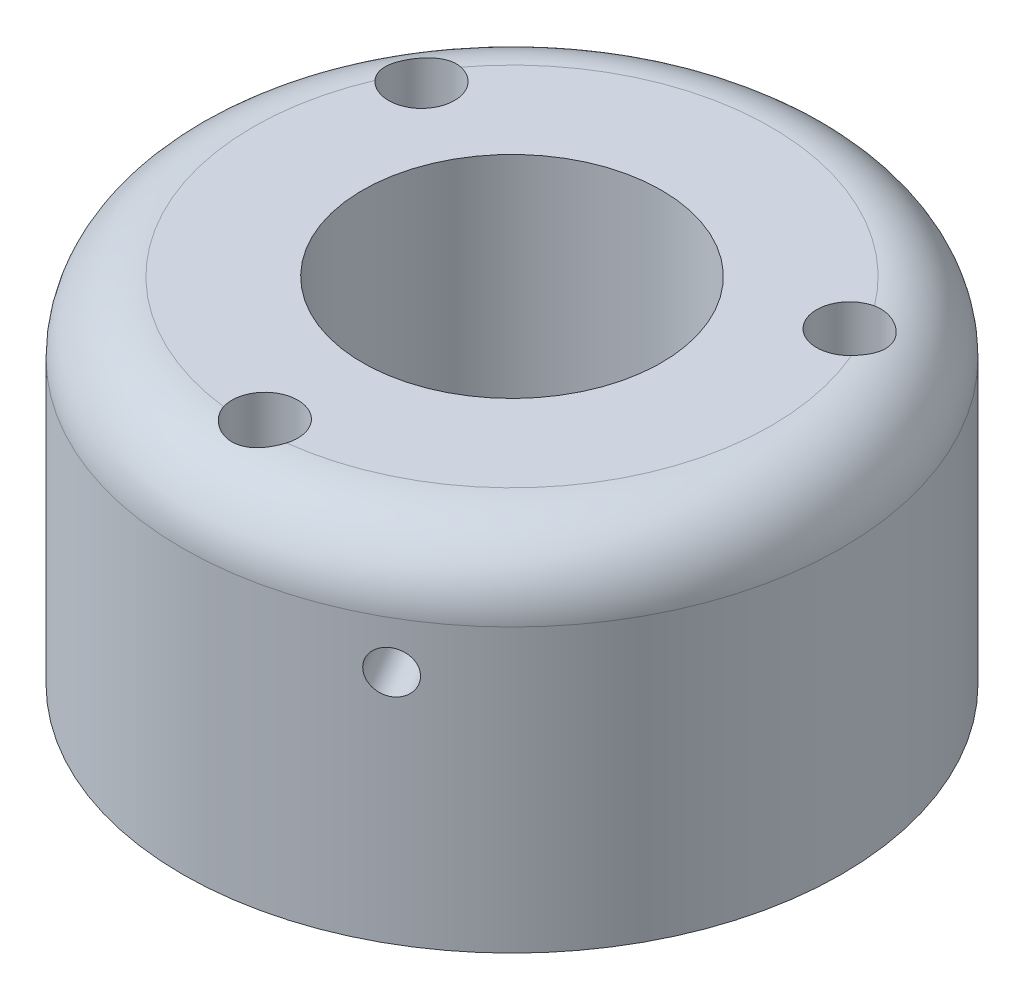
ISO-10303-21;
HEADER;
FILE_DESCRIPTION(('STEP AP214'),'2;1');
FILE_NAME('part.step','',(''),(''),'','','');
FILE_SCHEMA(('AUTOMOTIVE_DESIGN { 1 0 10303 214 1 1 1 1 }'));
ENDSEC;
DATA;
#1=APPLICATION_CONTEXT('core data for automotive mechanical design processes');
#2=APPLICATION_PROTOCOL_DEFINITION('international standard','automotive_design',2000,#1);
#3=PRODUCT_CONTEXT('',#1,'mechanical');
#4=PRODUCT('Part','Part','',(#3));
#5=PRODUCT_RELATED_PRODUCT_CATEGORY('part','',(#4));
#6=PRODUCT_DEFINITION_FORMATION('','',#4);
#7=PRODUCT_DEFINITION_CONTEXT('part definition',#1,'design');
#8=PRODUCT_DEFINITION('design','',#6,#7);
#9=PRODUCT_DEFINITION_SHAPE('','',#8);
#10=(LENGTH_UNIT() NAMED_UNIT(*) SI_UNIT(.MILLI.,.METRE.));
#11=(NAMED_UNIT(*) PLANE_ANGLE_UNIT() SI_UNIT($,.RADIAN.));
#12=(NAMED_UNIT(*) SI_UNIT($,.STERADIAN.) SOLID_ANGLE_UNIT());
#13=UNCERTAINTY_MEASURE_WITH_UNIT(LENGTH_MEASURE(1.E-05),#10,'distance_accuracy_value','');
#14=(GEOMETRIC_REPRESENTATION_CONTEXT(3) GLOBAL_UNCERTAINTY_ASSIGNED_CONTEXT((#13)) GLOBAL_UNIT_ASSIGNED_CONTEXT((#10,
#11,#12)) REPRESENTATION_CONTEXT('',''));
#15=CARTESIAN_POINT('',(0.,0.,0.));
#16=DIRECTION('',(0.,0.,1.));
#17=DIRECTION('',(1.,0.,0.));
#18=AXIS2_PLACEMENT_3D('',#15,#16,#17);
#19=CARTESIAN_POINT('',(0.,15.,0.));
#20=DIRECTION('',(0.,-1.,0.));
#21=DIRECTION('',(0.,0.,-1.));
#22=AXIS2_PLACEMENT_3D('',#19,#20,#21);
#23=CYLINDRICAL_SURFACE('',#22,14.);
#24=CARTESIAN_POINT('',(0.,12.,0.));
#25=DIRECTION('',(0.,1.,0.));
#26=DIRECTION('',(0.,0.,1.));
#27=AXIS2_PLACEMENT_3D('',#24,#25,#26);
#28=CIRCLE('',#27,14.);
#29=CARTESIAN_POINT('',(0.,12.,14.));
#30=VERTEX_POINT('',#29);
#31=EDGE_CURVE('E11',#30,#30,#28,.F.);
#32=ORIENTED_EDGE('',*,*,#31,.T.);
#33=EDGE_LOOP('',(#32));
#34=FACE_BOUND('',#33,.T.);
#35=CARTESIAN_POINT('',(0.,0.,0.));
#36=DIRECTION('',(0.,1.,0.));
#37=DIRECTION('',(0.,0.,1.));
#38=AXIS2_PLACEMENT_3D('',#35,#36,#37);
#39=CIRCLE('',#38,14.);
#40=CARTESIAN_POINT('',(0.,0.,14.));
#41=VERTEX_POINT('',#40);
#42=EDGE_CURVE('E131',#41,#41,#39,.T.);
#43=ORIENTED_EDGE('',*,*,#42,.T.);
#44=EDGE_LOOP('',(#43));
#45=FACE_BOUND('',#44,.T.);
#46=CARTESIAN_POINT('',(6.20609787595201,10.,12.549276837894));
#47=CARTESIAN_POINT('',(6.20609999284573,9.94950267598448,12.549276062729));
#48=CARTESIAN_POINT('',(6.20992918556156,9.89897006662162,12.5473843622663));
#49=CARTESIAN_POINT('',(6.22513813055935,9.79930039050013,12.5398454740784));
#50=CARTESIAN_POINT('',(6.23652665400367,9.75016501411147,12.5341939237467));
#51=CARTESIAN_POINT('',(6.26649167631466,9.65474794602,12.5192396260361));
#52=CARTESIAN_POINT('',(6.2850643600474,9.6084647547684,12.5099388165515));
#53=CARTESIAN_POINT('',(6.32881240844834,9.52004777042807,12.4878633442557));
#54=CARTESIAN_POINT('',(6.35398626871464,9.47791303491571,12.4750894729277));
#55=CARTESIAN_POINT('',(6.41020147818329,9.39891031908427,12.4462971489199));
#56=CARTESIAN_POINT('',(6.44125097170612,9.36204977546501,12.4302741903893));
#57=CARTESIAN_POINT('',(6.50824913052464,9.29470544425734,12.3953264489599));
#58=CARTESIAN_POINT('',(6.54419800077302,9.26422192357041,12.3764015446615));
#59=CARTESIAN_POINT('',(6.61994481385746,9.21047403115826,12.3360516713299));
#60=CARTESIAN_POINT('',(6.65974600336159,9.18721581951803,12.3146245903095));
#61=CARTESIAN_POINT('',(6.74198661499837,9.14861820179238,12.2697924828396));
#62=CARTESIAN_POINT('',(6.7844260075524,9.13327870694298,12.2463874785649));
#63=CARTESIAN_POINT('',(6.87063559196996,9.1109746083901,12.1982293669008));
#64=CARTESIAN_POINT('',(6.9144038441672,9.1039983480394,12.17347818626));
#65=CARTESIAN_POINT('',(7.00206287615598,9.09858274886685,12.1232696212586));
#66=CARTESIAN_POINT('',(7.0459536544933,9.10014330915092,12.0978122452479));
#67=CARTESIAN_POINT('',(7.13254802024577,9.11174744279204,12.0469613147288));
#68=CARTESIAN_POINT('',(7.17525326615978,9.12177847717929,12.0215677215004));
#69=CARTESIAN_POINT('',(7.25836085843451,9.15001935377288,11.9715726169929));
#70=CARTESIAN_POINT('',(7.29876319054988,9.16822924656576,11.9469711106139));
#71=CARTESIAN_POINT('',(7.37619872443083,9.21232510957342,11.8993177578575));
#72=CARTESIAN_POINT('',(7.41322940773714,9.23821675720414,11.8762670731705));
#73=CARTESIAN_POINT('',(7.48290524193962,9.29693703089889,11.8324902223942));
#74=CARTESIAN_POINT('',(7.51555034052056,9.32976573970245,11.8117640840346));
#75=CARTESIAN_POINT('',(7.57565842612462,9.40149905576524,11.7733036067041));
#76=CARTESIAN_POINT('',(7.60311193148399,9.44041454733569,11.7555747479518));
#77=CARTESIAN_POINT('',(7.65205447789644,9.52317864234412,11.7237757078129));
#78=CARTESIAN_POINT('',(7.67354351642618,9.56702724786912,11.7097055279741));
#79=CARTESIAN_POINT('',(7.71000738265135,9.65841988444582,11.6857291064966));
#80=CARTESIAN_POINT('',(7.72498181456386,9.70596413981315,11.6758231178467));
#81=CARTESIAN_POINT('',(7.7480312471322,9.80339524148211,11.6605404976868));
#82=CARTESIAN_POINT('',(7.756106333682,9.85328205861165,11.6551638097888));
#83=CARTESIAN_POINT('',(7.76514268455933,9.95388662905015,11.6491454250197));
#84=CARTESIAN_POINT('',(7.76611665024858,10.0046027360681,11.648495274073));
#85=CARTESIAN_POINT('',(7.76095951375784,10.1055102307222,11.6519318851311));
#86=CARTESIAN_POINT('',(7.75482845072251,10.1557016212478,11.6560186210384));
#87=CARTESIAN_POINT('',(7.73562584176534,10.2540918250589,11.6687713204567));
#88=CARTESIAN_POINT('',(7.7225601655153,10.3022922863951,11.6774334112157));
#89=CARTESIAN_POINT('',(7.68982436368927,10.3953832786039,11.699016343338));
#90=CARTESIAN_POINT('',(7.67015417474913,10.4402737777155,11.7119372255604));
#91=CARTESIAN_POINT('',(7.62467811308381,10.5255404917088,11.7415935380714));
#92=CARTESIAN_POINT('',(7.59886357398079,10.5659102108516,11.7583343548447));
#93=CARTESIAN_POINT('',(7.54177681006786,10.6409239645581,11.7950307712438));
#94=CARTESIAN_POINT('',(7.51050452881779,10.675567939903,11.8149864041149));
#95=CARTESIAN_POINT('',(7.44326526126498,10.7381982631127,11.8574610625019));
#96=CARTESIAN_POINT('',(7.40729144486579,10.7661747546072,11.8799838111545));
#97=CARTESIAN_POINT('',(7.33163875264913,10.8146084998079,11.926820607618));
#98=CARTESIAN_POINT('',(7.29195990075937,10.8350658020701,11.9511346438603));
#99=CARTESIAN_POINT('',(7.21000304544679,10.8678633331619,12.0007561105487));
#100=CARTESIAN_POINT('',(7.16772706339606,10.8802097893702,12.0260627630218));
#101=CARTESIAN_POINT('',(7.08171814672445,10.8964555357234,12.0769103150842));
#102=CARTESIAN_POINT('',(7.03798522742803,10.9003549146884,12.1024512122076));
#103=CARTESIAN_POINT('',(6.95037767789375,10.89959494449,12.1529750515549));
#104=CARTESIAN_POINT('',(6.90650344538282,10.8949510155992,12.177958916828));
#105=CARTESIAN_POINT('',(6.81979333890901,10.8772682393795,12.2267286777644));
#106=CARTESIAN_POINT('',(6.77695746674707,10.8642293774915,12.25051457135));
#107=CARTESIAN_POINT('',(6.69357250170258,10.8301303762644,12.29627386154));
#108=CARTESIAN_POINT('',(6.65302338600252,10.8090703169779,12.3182472762305));
#109=CARTESIAN_POINT('',(6.57540897902169,10.7595288427185,12.3598518637997));
#110=CARTESIAN_POINT('',(6.53834360006056,10.7310476145932,12.3794830956308));
#111=CARTESIAN_POINT('',(6.46874376153039,10.6674151850095,12.4159938786536));
#112=CARTESIAN_POINT('',(6.43621705446922,10.6322528076187,12.4328687298567));
#113=CARTESIAN_POINT('',(6.37674935617756,10.5562717547912,12.4634742096495));
#114=CARTESIAN_POINT('',(6.34980973278072,10.5154516983087,12.4772040683657));
#115=CARTESIAN_POINT('',(6.30232624686831,10.4292649780002,12.5012557552455));
#116=CARTESIAN_POINT('',(6.28179066165311,10.3838925293872,12.5115731738214));
#117=CARTESIAN_POINT('',(6.24782400613701,10.289963794438,12.5285697229299));
#118=CARTESIAN_POINT('',(6.23438462626248,10.2414113071466,12.5352531091464));
#119=CARTESIAN_POINT('',(6.21852023803515,10.1604687840326,12.5431276116879));
#120=CARTESIAN_POINT('',(6.21386841714836,10.1286017803419,12.5454314989037));
#121=CARTESIAN_POINT('',(6.2076565623278,10.0644946493665,12.5485063584345));
#122=CARTESIAN_POINT('',(6.20609652381311,10.0322545226347,12.5492773330208));
#123=CARTESIAN_POINT('',(6.20609787595201,10.,12.549276837894));
#124=B_SPLINE_CURVE_WITH_KNOTS('',3,(#46,#47,#48,#49,#50,#51,#52,#53,#54,#55,#56,#57,#58,#59,
#60,#61,#62,#63,#64,#65,#66,#67,#68,#69,#70,#71,#72,#73,#74,#75,#76,#77,#78,#79,#80,#81,#82,#83,
#84,#85,#86,#87,#88,#89,#90,#91,#92,#93,#94,#95,#96,#97,#98,#99,#100,#101,#102,#103,#104,#105,
#106,#107,#108,#109,#110,#111,#112,#113,#114,#115,#116,#117,#118,#119,#120,#121,#122,#123),
.UNSPECIFIED.,.T.,.F.,(4,2,2,2,2,2,2,2,2,2,2,2,2,2,2,2,2,2,2,2,2,2,2,2,2,2,2,2,2,2,2,2,2,2,2,2,
2,2,4),(0.,0.151374221609512,0.30292439189959,0.45439419202117,0.605829502274196,0.757476278003,
0.909129399428626,1.06091146321744,1.21269182558529,1.36426039013322,1.51582716334229,
1.66716996251336,1.81851369775786,1.96996956765537,2.12142724409545,2.27315891871627,
2.42489065752919,2.57663161323748,2.7283706798065,2.87983827280076,3.03130503129847,
3.18264378761464,3.33398399592673,3.48553894229582,3.63709545603356,3.7888746411626,
3.94065284614524,4.09231438161418,4.24397432237132,4.39536079253531,4.54674752524614,
4.69813274713631,4.8495141578692,5.00115105828367,5.15282503883811,5.30469425510545,
5.45638523767468,5.55307373724514,5.64976209355701),.UNSPECIFIED.);
#125=CARTESIAN_POINT('',(6.20609787595201,10.,12.549276837894));
#126=VERTEX_POINT('',#125);
#127=EDGE_CURVE('E129',#126,#126,#124,.T.);
#128=ORIENTED_EDGE('',*,*,#127,.F.);
#129=EDGE_LOOP('',(#128));
#130=FACE_BOUND('',#129,.T.);
#131=ADVANCED_FACE('F34',(#34,#45,#130),#23,.T.);
#132=CARTESIAN_POINT('',(0.,15.,0.));
#133=DIRECTION('',(0.,-1.,0.));
#134=DIRECTION('',(0.,0.,-1.));
#135=AXIS2_PLACEMENT_3D('',#132,#133,#134);
#136=CYLINDRICAL_SURFACE('',#135,6.35);
#137=CARTESIAN_POINT('',(0.,15.,0.));
#138=DIRECTION('',(0.,-1.,0.));
#139=DIRECTION('',(0.,0.,-1.));
#140=AXIS2_PLACEMENT_3D('',#137,#138,#139);
#141=CIRCLE('',#140,6.35);
#142=CARTESIAN_POINT('',(0.,15.,-6.35));
#143=VERTEX_POINT('',#142);
#144=EDGE_CURVE('E139',#143,#143,#141,.T.);
#145=ORIENTED_EDGE('',*,*,#144,.F.);
#146=EDGE_LOOP('',(#145));
#147=FACE_BOUND('',#146,.T.);
#148=CARTESIAN_POINT('',(0.,0.,0.));
#149=DIRECTION('',(0.,-1.,0.));
#150=DIRECTION('',(0.,0.,-1.));
#151=AXIS2_PLACEMENT_3D('',#148,#149,#150);
#152=CIRCLE('',#151,6.35);
#153=CARTESIAN_POINT('',(0.,0.,-6.35));
#154=VERTEX_POINT('',#153);
#155=EDGE_CURVE('E136',#154,#154,#152,.T.);
#156=ORIENTED_EDGE('',*,*,#155,.T.);
#157=EDGE_LOOP('',(#156));
#158=FACE_BOUND('',#157,.T.);
#159=CARTESIAN_POINT('',(2.36352559305971,10.,5.89374641216873));
#160=CARTESIAN_POINT('',(2.36352781310025,10.0502802424637,5.89374605818578));
#161=CARTESIAN_POINT('',(2.36749182693152,10.1005904585112,5.89216064592296));
#162=CARTESIAN_POINT('',(2.3832148292178,10.1998065460037,5.88581822512839));
#163=CARTESIAN_POINT('',(2.39498161081419,10.2487109623821,5.88105804571881));
#164=CARTESIAN_POINT('',(2.42587792375449,10.343664836159,5.86838080686043));
#165=CARTESIAN_POINT('',(2.44500203389271,10.3897163667502,5.86046607167387));
#166=CARTESIAN_POINT('',(2.48994402384018,10.4777153770391,5.841512710072));
#167=CARTESIAN_POINT('',(2.51576090439365,10.5196634681091,5.83047454997329));
#168=CARTESIAN_POINT('',(2.57341262748554,10.5985724271932,5.80525975287268));
#169=CARTESIAN_POINT('',(2.60528493205409,10.6354996543833,5.79106347935295));
#170=CARTESIAN_POINT('',(2.67390259714827,10.7030274507906,5.75970182139592));
#171=CARTESIAN_POINT('',(2.71064821628418,10.7336276840351,5.7425362793749));
#172=CARTESIAN_POINT('',(2.78801612631159,10.7877558809798,5.70537577726815));
#173=CARTESIAN_POINT('',(2.82865432551804,10.8112530368883,5.68536902979045));
#174=CARTESIAN_POINT('',(2.91240155812884,10.8503105139046,5.64292639986821));
#175=CARTESIAN_POINT('',(2.95551047454919,10.8658712104446,5.62049063238875));
#176=CARTESIAN_POINT('',(3.04258038199655,10.8885125489595,5.573834099492));
#177=CARTESIAN_POINT('',(3.08653371192916,10.895649407298,5.54962632554713));
#178=CARTESIAN_POINT('',(3.17426485318851,10.9014149195289,5.49991671147966));
#179=CARTESIAN_POINT('',(3.21804267316556,10.9000439980316,5.47441493600172));
#180=CARTESIAN_POINT('',(3.30385951880646,10.8888774703168,5.42305228860216));
#181=CARTESIAN_POINT('',(3.34590876063465,10.8791423363642,5.39719530214542));
#182=CARTESIAN_POINT('',(3.42747114323975,10.8516185134097,5.34577098646232));
#183=CARTESIAN_POINT('',(3.46698422450881,10.8338296355157,5.32020366404414));
#184=CARTESIAN_POINT('',(3.54260529298704,10.7906405410569,5.27015302662008));
#185=CARTESIAN_POINT('',(3.57870122969683,10.7652146181276,5.24567369841593));
#186=CARTESIAN_POINT('',(3.64647712534101,10.7074919248456,5.19878884108847));
#187=CARTESIAN_POINT('',(3.67815682418866,10.6751947501053,5.17638343413125));
#188=CARTESIAN_POINT('',(3.73663924273819,10.6043088270259,5.1343294138725));
#189=CARTESIAN_POINT('',(3.76339668521957,10.5656673123875,5.11470674123292));
#190=CARTESIAN_POINT('',(3.81109048254145,10.4833695662757,5.07926913412958));
#191=CARTESIAN_POINT('',(3.8320268084277,10.4397133098604,5.06345421860567));
#192=CARTESIAN_POINT('',(3.86762590134237,10.34857370591,5.0363154892842));
#193=CARTESIAN_POINT('',(3.88228462638836,10.3010879159472,5.02499456939414));
#194=CARTESIAN_POINT('',(3.90497826329582,10.2036648213403,5.0073798599995));
#195=CARTESIAN_POINT('',(3.91301358968135,10.1537276703213,5.00108575589345));
#196=CARTESIAN_POINT('',(3.92223801364166,10.05328245873,4.99385457937796));
#197=CARTESIAN_POINT('',(3.92348579650372,10.0027830872068,4.9928715874485));
#198=CARTESIAN_POINT('',(3.91926475641561,9.90224163398887,4.9961856138318));
#199=CARTESIAN_POINT('',(3.91379611883104,9.85219953971225,5.00048248642626));
#200=CARTESIAN_POINT('',(3.89630516274304,9.75421910689409,5.01412274734323));
#201=CARTESIAN_POINT('',(3.88431193663121,9.70627244279373,5.02344373203916));
#202=CARTESIAN_POINT('',(3.85405545126092,9.613582081972,5.04669381285137));
#203=CARTESIAN_POINT('',(3.83579191316423,9.56883852779858,5.0606231138966));
#204=CARTESIAN_POINT('',(3.7932472791012,9.48349266727188,5.09259120468687));
#205=CARTESIAN_POINT('',(3.76892641974704,9.44292033406228,5.1106570832013));
#206=CARTESIAN_POINT('',(3.71486328572855,9.3673759292022,5.15008809662905));
#207=CARTESIAN_POINT('',(3.68512073830451,9.33240413947581,5.17145339752474));
#208=CARTESIAN_POINT('',(3.62064103929824,9.26879059433453,5.21680174416725));
#209=CARTESIAN_POINT('',(3.58586855902885,9.24019759219678,5.24080298990689));
#210=CARTESIAN_POINT('',(3.51232338262757,9.19049212159547,5.29037316284831));
#211=CARTESIAN_POINT('',(3.47355078621016,9.16937946672072,5.3159420509656));
#212=CARTESIAN_POINT('',(3.3931203906478,9.13531281897608,5.36763539237509));
#213=CARTESIAN_POINT('',(3.35147272791636,9.122331640129,5.39375768928713));
#214=CARTESIAN_POINT('',(3.26629455956808,9.10480827810918,5.44576057164266));
#215=CARTESIAN_POINT('',(3.222764164572,9.10026559981601,5.47164117117883));
#216=CARTESIAN_POINT('',(3.13543906386586,9.09975928066233,5.52214124866931));
#217=CARTESIAN_POINT('',(3.09165001289754,9.10372084462056,5.54676978721703));
#218=CARTESIAN_POINT('',(3.00470419254861,9.11995090388287,5.59434619825955));
#219=CARTESIAN_POINT('',(2.96154742175292,9.13221938059277,5.61729407451622));
#220=CARTESIAN_POINT('',(2.87717691851967,9.16468951265263,5.66097255102201));
#221=CARTESIAN_POINT('',(2.83596206835269,9.18488654044152,5.68170443568798));
#222=CARTESIAN_POINT('',(2.75669502317559,9.23263259057649,5.72058422307279));
#223=CARTESIAN_POINT('',(2.71864290849197,9.26018179957696,5.73873206017085));
#224=CARTESIAN_POINT('',(2.64657195992202,9.32212294274866,5.77232651711363));
#225=CARTESIAN_POINT('',(2.61258959145261,9.35657027659383,5.78774922998046));
#226=CARTESIAN_POINT('',(2.55011631531478,9.43121348024346,5.81554632438171));
#227=CARTESIAN_POINT('',(2.52162670148719,9.47141070058246,5.8279199878905));
#228=CARTESIAN_POINT('',(2.47096998019096,9.55664665009723,5.84957882037539));
#229=CARTESIAN_POINT('',(2.44883509637157,9.60170851392795,5.85884828669913));
#230=CARTESIAN_POINT('',(2.4118724891311,9.69521102002221,5.87416163323606));
#231=CARTESIAN_POINT('',(2.39703705452118,9.74364803470969,5.88020891794697));
#232=CARTESIAN_POINT('',(2.37862332191816,9.82692892552903,5.88767468966328));
#233=CARTESIAN_POINT('',(2.37297173557425,9.86125433354262,5.88995092169096));
#234=CARTESIAN_POINT('',(2.36542212298868,9.93038170725221,5.89298689722956));
#235=CARTESIAN_POINT('',(2.36352405580243,9.96518366774567,5.89374665728266));
#236=CARTESIAN_POINT('',(2.36352559305971,10.,5.89374641216873));
#237=B_SPLINE_CURVE_WITH_KNOTS('',3,(#159,#160,#161,#162,#163,#164,#165,#166,#167,#168,#169,
#170,#171,#172,#173,#174,#175,#176,#177,#178,#179,#180,#181,#182,#183,#184,#185,#186,#187,#188,
#189,#190,#191,#192,#193,#194,#195,#196,#197,#198,#199,#200,#201,#202,#203,#204,#205,#206,#207,
#208,#209,#210,#211,#212,#213,#214,#215,#216,#217,#218,#219,#220,#221,#222,#223,#224,#225,#226,
#227,#228,#229,#230,#231,#232,#233,#234,#235,#236),.UNSPECIFIED.,.T.,.F.,(4,2,2,2,2,2,2,2,2,2,2,
2,2,2,2,2,2,2,2,2,2,2,2,2,2,2,2,2,2,2,2,2,2,2,2,2,2,2,4),(0.,0.150713494565003,
0.301577743864351,0.452331041954934,0.603061844961302,0.754757445237245,0.906461098707779,
1.05881358732013,1.2111588682671,1.36248162129027,1.51379682208597,1.66402715027234,
1.81426100213868,1.96500632006344,2.11576051212664,2.26783874791001,2.41991774011718,
2.57209450530924,2.72426174582612,2.87511122802495,3.02595654704242,3.17613471198119,
3.32631955614693,3.47751754958608,3.62872315174538,3.78104758632851,3.93336822470074,
4.08517685242569,4.2369765726525,4.38744668079017,4.53791645211693,4.68829853084439,
4.83868442777848,4.99033037620199,5.14201200192351,5.29444971421136,5.4467260426265,
5.55108807600073,5.65544897095419),.UNSPECIFIED.);
#238=CARTESIAN_POINT('',(2.36352559305971,10.,5.89374641216873));
#239=VERTEX_POINT('',#238);
#240=EDGE_CURVE('E123',#239,#239,#237,.T.);
#241=ORIENTED_EDGE('',*,*,#240,.F.);
#242=EDGE_LOOP('',(#241));
#243=FACE_BOUND('',#242,.T.);
#244=ADVANCED_FACE('F116',(#147,#158,#243),#136,.F.);
#245=CARTESIAN_POINT('',(0.,15.,0.));
#246=DIRECTION('',(0.,1.,0.));
#247=DIRECTION('',(0.,0.,1.));
#248=AXIS2_PLACEMENT_3D('',#245,#246,#247);
#249=PLANE('',#248);
#250=CARTESIAN_POINT('',(0.,15.,10.5));
#251=DIRECTION('',(0.,-1.,0.));
#252=DIRECTION('',(0.,0.,-1.));
#253=AXIS2_PLACEMENT_3D('',#250,#251,#252);
#254=CIRCLE('',#253,1.4);
#255=CARTESIAN_POINT('',(-1.33596330757386,15.,10.9185714285714));
#256=VERTEX_POINT('',#255);
#257=CARTESIAN_POINT('',(1.33596330757386,15.,10.9185714285714));
#258=VERTEX_POINT('',#257);
#259=EDGE_CURVE('E134',#256,#258,#254,.T.);
#260=ORIENTED_EDGE('',*,*,#259,.T.);
#261=CARTESIAN_POINT('',(0.,15.,0.));
#262=DIRECTION('',(0.,1.,0.));
#263=DIRECTION('',(0.,0.,1.));
#264=AXIS2_PLACEMENT_3D('',#261,#262,#263);
#265=CIRCLE('',#264,11.);
#266=CARTESIAN_POINT('',(10.1237418839647,15.,-4.30230755140292));
#267=VERTEX_POINT('',#266);
#268=EDGE_CURVE('E79',#258,#267,#265,.T.);
#269=ORIENTED_EDGE('',*,*,#268,.T.);
#270=CARTESIAN_POINT('',(9.09326673973658,15.,-5.25000000000004));
#271=DIRECTION('',(0.,-1.,0.));
#272=DIRECTION('',(0.,0.,-1.));
#273=AXIS2_PLACEMENT_3D('',#270,#271,#272);
#274=CIRCLE('',#273,1.4);
#275=CARTESIAN_POINT('',(8.78777857639085,15.,-6.6162638771686));
#276=VERTEX_POINT('',#275);
#277=EDGE_CURVE('E76',#267,#276,#274,.T.);
#278=ORIENTED_EDGE('',*,*,#277,.T.);
#279=CARTESIAN_POINT('',(0.,15.,0.));
#280=DIRECTION('',(0.,1.,0.));
#281=DIRECTION('',(0.,0.,1.));
#282=AXIS2_PLACEMENT_3D('',#279,#280,#281);
#283=CIRCLE('',#282,11.);
#284=CARTESIAN_POINT('',(-8.78777857639094,15.,-6.61626387716847));
#285=VERTEX_POINT('',#284);
#286=EDGE_CURVE('E69',#276,#285,#283,.T.);
#287=ORIENTED_EDGE('',*,*,#286,.T.);
#288=CARTESIAN_POINT('',(-9.09326673973666,15.,-5.24999999999992));
#289=DIRECTION('',(0.,-1.,0.));
#290=DIRECTION('',(0.,0.,-1.));
#291=AXIS2_PLACEMENT_3D('',#288,#289,#290);
#292=CIRCLE('',#291,1.4);
#293=CARTESIAN_POINT('',(-10.1237418839648,15.,-4.30230755140278));
#294=VERTEX_POINT('',#293);
#295=EDGE_CURVE('E73',#285,#294,#292,.T.);
#296=ORIENTED_EDGE('',*,*,#295,.T.);
#297=CARTESIAN_POINT('',(0.,15.,0.));
#298=DIRECTION('',(0.,1.,0.));
#299=DIRECTION('',(0.,0.,1.));
#300=AXIS2_PLACEMENT_3D('',#297,#298,#299);
#301=CIRCLE('',#300,11.);
#302=EDGE_CURVE('E50',#294,#256,#301,.T.);
#303=ORIENTED_EDGE('',*,*,#302,.T.);
#304=EDGE_LOOP('',(#260,#269,#278,#287,#296,#303));
#305=FACE_BOUND('',#304,.T.);
#306=ORIENTED_EDGE('',*,*,#144,.T.);
#307=EDGE_LOOP('',(#306));
#308=FACE_BOUND('',#307,.T.);
#309=ADVANCED_FACE('F71',(#305,#308),#249,.T.);
#310=CARTESIAN_POINT('',(0.,0.,0.));
#311=DIRECTION('',(0.,1.,0.));
#312=DIRECTION('',(0.,0.,1.));
#313=AXIS2_PLACEMENT_3D('',#310,#311,#312);
#314=PLANE('',#313);
#315=CARTESIAN_POINT('',(-9.0932667397366,0.,5.24999999999926));
#316=DIRECTION('',(0.,-1.,0.));
#317=DIRECTION('',(0.,0.,-1.));
#318=AXIS2_PLACEMENT_3D('',#315,#316,#317);
#319=CIRCLE('',#318,2.8);
#320=CARTESIAN_POINT('',(-9.0932667397366,0.,2.44999999999926));
#321=VERTEX_POINT('',#320);
#322=EDGE_CURVE('E307',#321,#321,#319,.T.);
#323=ORIENTED_EDGE('',*,*,#322,.F.);
#324=EDGE_LOOP('',(#323));
#325=FACE_BOUND('',#324,.T.);
#326=CARTESIAN_POINT('',(6.30852653991129E-13,0.,-10.5000000000004));
#327=DIRECTION('',(0.,-1.,0.));
#328=DIRECTION('',(0.,0.,-1.));
#329=AXIS2_PLACEMENT_3D('',#326,#327,#328);
#330=CIRCLE('',#329,2.8);
#331=CARTESIAN_POINT('',(6.30852653991129E-13,0.,-13.3000000000004));
#332=VERTEX_POINT('',#331);
#333=EDGE_CURVE('E306',#332,#332,#330,.T.);
#334=ORIENTED_EDGE('',*,*,#333,.F.);
#335=EDGE_LOOP('',(#334));
#336=FACE_BOUND('',#335,.T.);
#337=CARTESIAN_POINT('',(9.09326673973662,0.,5.24999999999998));
#338=DIRECTION('',(0.,-1.,0.));
#339=DIRECTION('',(0.,0.,-1.));
#340=AXIS2_PLACEMENT_3D('',#337,#338,#339);
#341=CIRCLE('',#340,2.8);
#342=CARTESIAN_POINT('',(9.09326673973662,0.,2.44999999999998));
#343=VERTEX_POINT('',#342);
#344=EDGE_CURVE('E173',#343,#343,#341,.T.);
#345=ORIENTED_EDGE('',*,*,#344,.F.);
#346=EDGE_LOOP('',(#345));
#347=FACE_BOUND('',#346,.T.);
#348=CARTESIAN_POINT('',(0.,0.,10.5));
#349=DIRECTION('',(0.,-1.,0.));
#350=DIRECTION('',(0.,0.,-1.));
#351=AXIS2_PLACEMENT_3D('',#348,#349,#350);
#352=CIRCLE('',#351,1.4);
#353=CARTESIAN_POINT('',(0.,0.,9.1));
#354=VERTEX_POINT('',#353);
#355=EDGE_CURVE('E146',#354,#354,#352,.T.);
#356=ORIENTED_EDGE('',*,*,#355,.F.);
#357=EDGE_LOOP('',(#356));
#358=FACE_BOUND('',#357,.T.);
#359=ORIENTED_EDGE('',*,*,#155,.F.);
#360=EDGE_LOOP('',(#359));
#361=FACE_BOUND('',#360,.T.);
#362=ORIENTED_EDGE('',*,*,#42,.F.);
#363=EDGE_LOOP('',(#362));
#364=FACE_BOUND('',#363,.T.);
#365=CARTESIAN_POINT('',(9.09326673973658,0.,-5.25000000000004));
#366=DIRECTION('',(0.,-1.,0.));
#367=DIRECTION('',(0.,0.,-1.));
#368=AXIS2_PLACEMENT_3D('',#365,#366,#367);
#369=CIRCLE('',#368,1.4);
#370=CARTESIAN_POINT('',(9.09326673973658,0.,-6.65000000000004));
#371=VERTEX_POINT('',#370);
#372=EDGE_CURVE('E85',#371,#371,#369,.T.);
#373=ORIENTED_EDGE('',*,*,#372,.F.);
#374=EDGE_LOOP('',(#373));
#375=FACE_BOUND('',#374,.T.);
#376=CARTESIAN_POINT('',(-9.09326673973666,0.,-5.24999999999992));
#377=DIRECTION('',(0.,-1.,0.));
#378=DIRECTION('',(0.,0.,-1.));
#379=AXIS2_PLACEMENT_3D('',#376,#377,#378);
#380=CIRCLE('',#379,1.4);
#381=CARTESIAN_POINT('',(-9.09326673973666,0.,-6.64999999999992));
#382=VERTEX_POINT('',#381);
#383=EDGE_CURVE('E86',#382,#382,#380,.T.);
#384=ORIENTED_EDGE('',*,*,#383,.F.);
#385=EDGE_LOOP('',(#384));
#386=FACE_BOUND('',#385,.T.);
#387=ADVANCED_FACE('F152',(#325,#336,#347,#358,#361,#364,#375,#386),#314,.F.);
#388=CARTESIAN_POINT('',(0.,15.,10.5));
#389=DIRECTION('',(0.,-1.,0.));
#390=DIRECTION('',(0.,0.,-1.));
#391=AXIS2_PLACEMENT_3D('',#388,#389,#390);
#392=CYLINDRICAL_SURFACE('',#391,1.4);
#393=ORIENTED_EDGE('',*,*,#259,.F.);
#394=CARTESIAN_POINT('',(-1.33596330757386,15.,10.9185714285714));
#395=CARTESIAN_POINT('',(-1.32441401062772,15.0000018380381,10.9554372260775));
#396=CARTESIAN_POINT('',(-1.31134277213357,14.9993804968653,10.9918018824445));
#397=CARTESIAN_POINT('',(-1.28226315501589,14.9970455140652,11.0632849834086));
#398=CARTESIAN_POINT('',(-1.26625594297071,14.9953323056133,11.0984039163901));
#399=CARTESIAN_POINT('',(-1.21408917627997,14.988799285299,11.2013440696474));
#400=CARTESIAN_POINT('',(-1.17370728329223,14.9825840521503,11.2669936252768));
#401=CARTESIAN_POINT('',(-1.08297623655958,14.9678507040426,11.3905284637219));
#402=CARTESIAN_POINT('',(-1.03263679934041,14.9593348310974,11.4484212239332));
#403=CARTESIAN_POINT('',(-0.923249235621274,14.9414488399935,11.555202946673));
#404=CARTESIAN_POINT('',(-0.864196498796118,14.9320782706117,11.6040871116468));
#405=CARTESIAN_POINT('',(-0.736818650376979,14.9135969092506,11.6930320798699));
#406=CARTESIAN_POINT('',(-0.668255353452161,14.904504331399,11.7327562361636));
#407=CARTESIAN_POINT('',(-0.525220228457292,14.8882980444874,11.8001504016845));
#408=CARTESIAN_POINT('',(-0.450749111496837,14.8811840977276,11.8278218590704));
#409=CARTESIAN_POINT('',(-0.298638519391847,14.870070107299,11.87003259883));
#410=CARTESIAN_POINT('',(-0.221032097817005,14.8660436102318,11.8846836173851));
#411=CARTESIAN_POINT('',(-0.0643678581779517,14.8616234458039,11.9007332035797));
#412=CARTESIAN_POINT('',(0.0146895966556971,14.8612288813777,11.902135043689));
#413=CARTESIAN_POINT('',(0.169302034956192,14.8640827575054,11.8918143741052));
#414=CARTESIAN_POINT('',(0.244887806730471,14.8672142538447,11.8805131899316));
#415=CARTESIAN_POINT('',(0.393044883455445,14.8764779630047,11.8458473663809));
#416=CARTESIAN_POINT('',(0.465615942207524,14.8826104203804,11.8224817438374));
#417=CARTESIAN_POINT('',(0.606382726589488,14.8970648837805,11.764180051341));
#418=CARTESIAN_POINT('',(0.674539364779257,14.905403801916,11.7291540470001));
#419=CARTESIAN_POINT('',(0.804174214477187,14.9230658350847,11.6485351993392));
#420=CARTESIAN_POINT('',(0.865649661498044,14.9323893543956,11.6029380062264));
#421=CARTESIAN_POINT('',(0.98235605808981,14.9509679368099,11.5006022779807));
#422=CARTESIAN_POINT('',(1.03730293333163,14.9602098475059,11.4435371113144));
#423=CARTESIAN_POINT('',(1.13687592508638,14.976680960134,11.3208172522153));
#424=CARTESIAN_POINT('',(1.18151392250238,14.9839124810045,11.2551725856678));
#425=CARTESIAN_POINT('',(1.24415351248499,14.992693759531,11.1437787473555));
#426=CARTESIAN_POINT('',(1.2657878417463,14.9953591847075,11.1001229597592));
#427=CARTESIAN_POINT('',(1.30441092088983,14.9990147570253,11.010767816507));
#428=CARTESIAN_POINT('',(1.32140233571101,15.0000058668899,10.9650696507367));
#429=CARTESIAN_POINT('',(1.33596330757386,15.,10.9185714285714));
#430=B_SPLINE_CURVE_WITH_KNOTS('',3,(#394,#395,#396,#397,#398,#399,#400,#401,#402,#403,#404,
#405,#406,#407,#408,#409,#410,#411,#412,#413,#414,#415,#416,#417,#418,#419,#420,#421,#422,#423,
#424,#425,#426,#427,#428,#429),.UNSPECIFIED.,.F.,.F.,(4,2,2,2,2,2,2,2,2,2,2,2,2,2,2,2,2,4),(0.,
0.115816211482048,0.231586503905991,0.462366827065027,0.692923056974565,0.923601717701415,
1.16174384972508,1.3998573605392,1.63590717515908,1.87189868532577,2.10028810144546,
2.32869613262382,2.55890830384832,2.78921537056067,3.02736824320629,3.26524526131888,
3.41136165398058,3.55739400177309),.UNSPECIFIED.);
#431=EDGE_CURVE('E43',#256,#258,#430,.T.);
#432=ORIENTED_EDGE('',*,*,#431,.T.);
#433=EDGE_LOOP('',(#393,#432));
#434=FACE_BOUND('',#433,.T.);
#435=ORIENTED_EDGE('',*,*,#355,.T.);
#436=EDGE_LOOP('',(#435));
#437=FACE_BOUND('',#436,.T.);
#438=ADVANCED_FACE('F114',(#434,#437),#392,.F.);
#439=CARTESIAN_POINT('',(9.09326673973658,15.,-5.25000000000004));
#440=DIRECTION('',(0.,-1.,0.));
#441=DIRECTION('',(0.,0.,-1.));
#442=AXIS2_PLACEMENT_3D('',#439,#440,#441);
#443=CYLINDRICAL_SURFACE('',#442,1.4);
#444=ORIENTED_EDGE('',*,*,#277,.F.);
#445=CARTESIAN_POINT('',(10.1237418839647,15.,-4.30230755140292));
#446=CARTESIAN_POINT('',(10.1498939526627,15.0000018380381,-4.33074243470715));
#447=CARTESIAN_POINT('',(10.1748510496293,14.9993804968653,-4.3602447874855));
#448=CARTESIAN_POINT('',(10.2222174224467,14.9970455140652,-4.42117002512383));
#449=CARTESIAN_POINT('',(10.2446277045399,14.9953323056133,-4.45259214388943));
#450=CARTESIAN_POINT('',(10.3076931089847,14.988799285299,-4.54923996570555));
#451=CARTESIAN_POINT('',(10.3443563454132,14.9825840521503,-4.61703648870058));
#452=CARTESIAN_POINT('',(10.4059751303927,14.9678507040426,-4.75737929930555));
#453=CARTESIAN_POINT('',(10.4309420128213,14.9593348310974,-4.8299209108552));
#454=CARTESIAN_POINT('',(10.4687239155142,14.9414488399935,-4.97804418126396));
#455=CARTESIAN_POINT('',(10.4815324758118,14.9320782706117,-5.05362743400445));
#456=CARTESIAN_POINT('',(10.4948721536221,14.9135969092506,-5.20841237072635));
#457=CARTESIAN_POINT('',(10.4949926336541,14.904504331399,-5.28765200577735));
#458=CARTESIAN_POINT('',(10.4818401305646,14.8882980444874,-5.44522114041683));
#459=CARTESIAN_POINT('',(10.4685687571402,14.8811840977276,-5.52355074824572));
#460=CARTESIAN_POINT('',(10.4290690340321,14.870070107299,-5.67638775507312));
#461=CARTESIAN_POINT('',(10.4029539775047,14.8660436102318,-5.7509223969313));
#462=CARTESIAN_POINT('',(10.3385212070499,14.8616234458039,-5.89462240142058));
#463=CARTESIAN_POINT('',(10.3002065087798,14.8612288813777,-5.96378908571972));
#464=CARTESIAN_POINT('',(10.2139623275859,14.8640827575054,-6.0925270502371));
#465=CARTESIAN_POINT('',(10.1663823291116,14.8672142538447,-6.1523356566715));
#466=CARTESIAN_POINT('',(10.0622823069111,14.8764779630047,-6.26331053709041));
#467=CARTESIAN_POINT('',(10.0057615548372,14.8826104203804,-6.3144761062775));
#468=CARTESIAN_POINT('',(9.88488741586064,14.8970648837805,-6.40723287131311));
#469=CARTESIAN_POINT('',(9.82047568721351,14.905403801916,-6.44874524925157));
#470=CARTESIAN_POINT('',(9.68584029226635,14.9230658350847,-6.52070289847529));
#471=CARTESIAN_POINT('',(9.61561424117894,14.9323893543956,-6.55114360074793));
#472=CARTESIAN_POINT('',(9.4686357025075,14.9509679368099,-6.60104644085769));
#473=CARTESIAN_POINT('',(9.39174238088239,14.9602098475059,-6.62009924734253));
#474=CARTESIAN_POINT('',(9.23567736947642,14.976680960134,-6.64497205818345));
#475=CARTESIAN_POINT('',(9.15650842191525,14.9839124810045,-6.65080736464599));
#476=CARTESIAN_POINT('',(9.02871873312045,14.992693759531,-6.64935792169743));
#477=CARTESIAN_POINT('',(8.98009454740924,14.9953591847075,-6.64626590663344));
#478=CARTESIAN_POINT('',(8.8833991838222,14.9990147570253,-6.63503690271798));
#479=CARTESIAN_POINT('',(8.83532770394818,15.0000058668899,-6.62690281671421));
#480=CARTESIAN_POINT('',(8.78777857639084,15.,-6.6162638771686));
#481=B_SPLINE_CURVE_WITH_KNOTS('',3,(#445,#446,#447,#448,#449,#450,#451,#452,#453,#454,#455,
#456,#457,#458,#459,#460,#461,#462,#463,#464,#465,#466,#467,#468,#469,#470,#471,#472,#473,#474,
#475,#476,#477,#478,#479,#480),.UNSPECIFIED.,.F.,.F.,(4,2,2,2,2,2,2,2,2,2,2,2,2,2,2,2,2,4),(0.,
0.115816211482051,0.231586503905993,0.462366827065028,0.692923056974569,0.923601717701416,
1.16174384972508,1.3998573605392,1.63590717515908,1.87189868532577,2.10028810144547,
2.32869613262382,2.55890830384832,2.78921537056067,3.02736824320629,3.26524526131889,
3.41136165398058,3.55739400177309),.UNSPECIFIED.);
#482=EDGE_CURVE('E88',#267,#276,#481,.T.);
#483=ORIENTED_EDGE('',*,*,#482,.T.);
#484=EDGE_LOOP('',(#444,#483));
#485=FACE_BOUND('',#484,.T.);
#486=ORIENTED_EDGE('',*,*,#372,.T.);
#487=EDGE_LOOP('',(#486));
#488=FACE_BOUND('',#487,.T.);
#489=ADVANCED_FACE('F108',(#485,#488),#443,.F.);
#490=CARTESIAN_POINT('',(-9.09326673973666,15.,-5.24999999999992));
#491=DIRECTION('',(0.,-1.,0.));
#492=DIRECTION('',(0.,0.,-1.));
#493=AXIS2_PLACEMENT_3D('',#490,#491,#492);
#494=CYLINDRICAL_SURFACE('',#493,1.4);
#495=ORIENTED_EDGE('',*,*,#295,.F.);
#496=CARTESIAN_POINT('',(-8.78777857639094,15.,-6.61626387716847));
#497=CARTESIAN_POINT('',(-8.82547994203502,15.0000018380381,-6.6246947913703));
#498=CARTESIAN_POINT('',(-8.8635082774958,14.9993804968653,-6.63155709495893));
#499=CARTESIAN_POINT('',(-8.93995426743091,14.9970455140652,-6.64211495828479));
#500=CARTESIAN_POINT('',(-8.97837176156922,14.9953323056133,-6.64581177250061));
#501=CARTESIAN_POINT('',(-9.09360393270486,14.988799285299,-6.65210410394177));
#502=CARTESIAN_POINT('',(-9.17064906212102,14.9825840521503,-6.64995713657622));
#503=CARTESIAN_POINT('',(-9.32299889383319,14.9678507040426,-6.63314916441634));
#504=CARTESIAN_POINT('',(-9.39830521348093,14.9593348310974,-6.61850031307795));
#505=CARTESIAN_POINT('',(-9.54547467989304,14.9414488399935,-6.577158765409));
#506=CARTESIAN_POINT('',(-9.61733597701573,14.9320782706117,-6.55045967764232));
#507=CARTESIAN_POINT('',(-9.75805350324525,14.9135969092506,-6.48461970914347));
#508=CARTESIAN_POINT('',(-9.82673728020199,14.904504331399,-6.44510423038625));
#509=CARTESIAN_POINT('',(-9.95661990210735,14.8882980444874,-6.35492926126765));
#510=CARTESIAN_POINT('',(-10.0178196456435,14.8811840977276,-6.30427111082463));
#511=CARTESIAN_POINT('',(-10.1304305146403,14.870070107299,-6.1936448437568));
#512=CARTESIAN_POINT('',(-10.1819218796878,14.8660436102318,-6.13376122045375));
#513=CARTESIAN_POINT('',(-10.274153348872,14.8616234458039,-6.00611080215903));
#514=CARTESIAN_POINT('',(-10.3148961054356,14.8612288813777,-5.93834595796922));
#515=CARTESIAN_POINT('',(-10.3832643625422,14.8640827575054,-5.79928732386803));
#516=CARTESIAN_POINT('',(-10.4112701358422,14.8672142538447,-5.72817753326007));
#517=CARTESIAN_POINT('',(-10.4553271903666,14.8764779630047,-5.58253682929044));
#518=CARTESIAN_POINT('',(-10.4713774970448,14.8826104203804,-5.50800563755987));
#519=CARTESIAN_POINT('',(-10.4912701424502,14.8970648837805,-5.35694718002782));
#520=CARTESIAN_POINT('',(-10.4950150519928,14.905403801916,-5.28040879774851));
#521=CARTESIAN_POINT('',(-10.4900145067436,14.9230658350847,-5.12783230086387));
#522=CARTESIAN_POINT('',(-10.4812639026771,14.9323893543956,-5.05179440547838));
#523=CARTESIAN_POINT('',(-10.4509917605974,14.9509679368099,-4.89955583712292));
#524=CARTESIAN_POINT('',(-10.4290453142141,14.9602098475059,-4.82343786397179));
#525=CARTESIAN_POINT('',(-10.3725532945629,14.976680960134,-4.67584519403184));
#526=CARTESIAN_POINT('',(-10.3380223444177,14.9839124810045,-4.60436522102173));
#527=CARTESIAN_POINT('',(-10.2728722456055,14.992693759531,-4.49442082565801));
#528=CARTESIAN_POINT('',(-10.2458823891556,14.9953591847075,-4.45385705312575));
#529=CARTESIAN_POINT('',(-10.1878101047121,14.9990147570253,-4.37573091378894));
#530=CARTESIAN_POINT('',(-10.1567300396593,15.0000058668899,-4.33816683402241));
#531=CARTESIAN_POINT('',(-10.1237418839648,15.,-4.30230755140278));
#532=B_SPLINE_CURVE_WITH_KNOTS('',3,(#496,#497,#498,#499,#500,#501,#502,#503,#504,#505,#506,
#507,#508,#509,#510,#511,#512,#513,#514,#515,#516,#517,#518,#519,#520,#521,#522,#523,#524,#525,
#526,#527,#528,#529,#530,#531),.UNSPECIFIED.,.F.,.F.,(4,2,2,2,2,2,2,2,2,2,2,2,2,2,2,2,2,4),(0.,
0.11581621148205,0.231586503905992,0.462366827065026,0.692923056974566,0.923601717701414,
1.16174384972508,1.3998573605392,1.63590717515908,1.87189868532577,2.10028810144546,
2.32869613262382,2.55890830384832,2.78921537056067,3.02736824320629,3.26524526131889,
3.41136165398058,3.55739400177309),.UNSPECIFIED.);
#533=EDGE_CURVE('E84',#285,#294,#532,.T.);
#534=ORIENTED_EDGE('',*,*,#533,.T.);
#535=EDGE_LOOP('',(#495,#534));
#536=FACE_BOUND('',#535,.T.);
#537=ORIENTED_EDGE('',*,*,#383,.T.);
#538=EDGE_LOOP('',(#537));
#539=FACE_BOUND('',#538,.T.);
#540=ADVANCED_FACE('F82',(#536,#539),#494,.F.);
#541=CARTESIAN_POINT('',(13.0466333698684,10.,22.5974318643354));
#542=DIRECTION('',(-0.500000000000004,0.,-0.866025403784436));
#543=DIRECTION('',(-0.866025403784436,0.,0.500000000000004));
#544=AXIS2_PLACEMENT_3D('',#541,#542,#543);
#545=CYLINDRICAL_SURFACE('',#544,0.9);
#546=ORIENTED_EDGE('',*,*,#240,.T.);
#547=EDGE_LOOP('',(#546));
#548=FACE_BOUND('',#547,.T.);
#549=ORIENTED_EDGE('',*,*,#127,.T.);
#550=EDGE_LOOP('',(#549));
#551=FACE_BOUND('',#550,.T.);
#552=ADVANCED_FACE('F107',(#548,#551),#545,.F.);
#553=CARTESIAN_POINT('',(9.09326673973662,5.,5.24999999999998));
#554=DIRECTION('',(0.,-1.,0.));
#555=DIRECTION('',(0.,0.,-1.));
#556=AXIS2_PLACEMENT_3D('',#553,#554,#555);
#557=CYLINDRICAL_SURFACE('',#556,2.8);
#558=CARTESIAN_POINT('',(9.09326673973662,5.,5.24999999999998));
#559=DIRECTION('',(0.,-1.,0.));
#560=DIRECTION('',(0.,0.,-1.));
#561=AXIS2_PLACEMENT_3D('',#558,#559,#560);
#562=CIRCLE('',#561,2.8);
#563=CARTESIAN_POINT('',(9.09326673973662,5.,2.44999999999998));
#564=VERTEX_POINT('',#563);
#565=EDGE_CURVE('E130',#564,#564,#562,.T.);
#566=ORIENTED_EDGE('',*,*,#565,.F.);
#567=EDGE_LOOP('',(#566));
#568=FACE_BOUND('',#567,.T.);
#569=ORIENTED_EDGE('',*,*,#344,.T.);
#570=EDGE_LOOP('',(#569));
#571=FACE_BOUND('',#570,.T.);
#572=ADVANCED_FACE('F209',(#568,#571),#557,.F.);
#573=CARTESIAN_POINT('',(9.09326673973662,5.,5.24999999999998));
#574=DIRECTION('',(0.,-1.,0.));
#575=DIRECTION('',(0.,0.,-1.));
#576=AXIS2_PLACEMENT_3D('',#573,#574,#575);
#577=PLANE('',#576);
#578=ORIENTED_EDGE('',*,*,#565,.T.);
#579=EDGE_LOOP('',(#578));
#580=FACE_BOUND('',#579,.T.);
#581=ADVANCED_FACE('F215',(#580),#577,.T.);
#582=CARTESIAN_POINT('',(6.30852653991129E-13,5.,-10.5000000000004));
#583=DIRECTION('',(0.,-1.,0.));
#584=DIRECTION('',(0.,0.,-1.));
#585=AXIS2_PLACEMENT_3D('',#582,#583,#584);
#586=CYLINDRICAL_SURFACE('',#585,2.8);
#587=CARTESIAN_POINT('',(6.30852653991129E-13,5.,-10.5000000000004));
#588=DIRECTION('',(0.,-1.,0.));
#589=DIRECTION('',(0.,0.,-1.));
#590=AXIS2_PLACEMENT_3D('',#587,#588,#589);
#591=CIRCLE('',#590,2.8);
#592=CARTESIAN_POINT('',(6.30852653991129E-13,5.,-13.3000000000004));
#593=VERTEX_POINT('',#592);
#594=EDGE_CURVE('E310',#593,#593,#591,.T.);
#595=ORIENTED_EDGE('',*,*,#594,.F.);
#596=EDGE_LOOP('',(#595));
#597=FACE_BOUND('',#596,.T.);
#598=ORIENTED_EDGE('',*,*,#333,.T.);
#599=EDGE_LOOP('',(#598));
#600=FACE_BOUND('',#599,.T.);
#601=ADVANCED_FACE('F222',(#597,#600),#586,.F.);
#602=CARTESIAN_POINT('',(6.30852653991129E-13,5.,-10.5000000000004));
#603=DIRECTION('',(0.,-1.,0.));
#604=DIRECTION('',(0.,0.,-1.));
#605=AXIS2_PLACEMENT_3D('',#602,#603,#604);
#606=PLANE('',#605);
#607=ORIENTED_EDGE('',*,*,#594,.T.);
#608=EDGE_LOOP('',(#607));
#609=FACE_BOUND('',#608,.T.);
#610=ADVANCED_FACE('F230',(#609),#606,.T.);
#611=CARTESIAN_POINT('',(-9.0932667397366,5.,5.24999999999926));
#612=DIRECTION('',(0.,-1.,0.));
#613=DIRECTION('',(0.,0.,-1.));
#614=AXIS2_PLACEMENT_3D('',#611,#612,#613);
#615=CYLINDRICAL_SURFACE('',#614,2.8);
#616=CARTESIAN_POINT('',(-9.0932667397366,5.,5.24999999999926));
#617=DIRECTION('',(0.,-1.,0.));
#618=DIRECTION('',(0.,0.,-1.));
#619=AXIS2_PLACEMENT_3D('',#616,#617,#618);
#620=CIRCLE('',#619,2.8);
#621=CARTESIAN_POINT('',(-9.0932667397366,5.,2.44999999999926));
#622=VERTEX_POINT('',#621);
#623=EDGE_CURVE('E305',#622,#622,#620,.T.);
#624=ORIENTED_EDGE('',*,*,#623,.F.);
#625=EDGE_LOOP('',(#624));
#626=FACE_BOUND('',#625,.T.);
#627=ORIENTED_EDGE('',*,*,#322,.T.);
#628=EDGE_LOOP('',(#627));
#629=FACE_BOUND('',#628,.T.);
#630=ADVANCED_FACE('F238',(#626,#629),#615,.F.);
#631=CARTESIAN_POINT('',(-9.0932667397366,5.,5.24999999999926));
#632=DIRECTION('',(0.,-1.,0.));
#633=DIRECTION('',(0.,0.,-1.));
#634=AXIS2_PLACEMENT_3D('',#631,#632,#633);
#635=PLANE('',#634);
#636=ORIENTED_EDGE('',*,*,#623,.T.);
#637=EDGE_LOOP('',(#636));
#638=FACE_BOUND('',#637,.T.);
#639=ADVANCED_FACE('F246',(#638),#635,.T.);
#640=CARTESIAN_POINT('',(0.,12.,0.));
#641=DIRECTION('',(0.,1.,0.));
#642=DIRECTION('',(0.,0.,1.));
#643=AXIS2_PLACEMENT_3D('',#640,#641,#642);
#644=TOROIDAL_SURFACE('',#643,11.,3.);
#645=ORIENTED_EDGE('',*,*,#31,.F.);
#646=EDGE_LOOP('',(#645));
#647=FACE_BOUND('',#646,.T.);
#648=ORIENTED_EDGE('',*,*,#482,.F.);
#649=ORIENTED_EDGE('',*,*,#268,.F.);
#650=ORIENTED_EDGE('',*,*,#431,.F.);
#651=ORIENTED_EDGE('',*,*,#302,.F.);
#652=ORIENTED_EDGE('',*,*,#533,.F.);
#653=ORIENTED_EDGE('',*,*,#286,.F.);
#654=EDGE_LOOP('',(#648,#649,#650,#651,#652,#653));
#655=FACE_BOUND('',#654,.T.);
#656=ADVANCED_FACE('F36',(#647,#655),#644,.T.);
#657=CLOSED_SHELL('',(#131,#244,#309,#387,#438,#489,#540,#552,#572,#581,#601,#610,#630,#639,#656));
#658=MANIFOLD_SOLID_BREP('B2',#657);
#659=ADVANCED_BREP_SHAPE_REPRESENTATION('',(#18,#658),#14);
#660=SHAPE_DEFINITION_REPRESENTATION(#9,#659);
ENDSEC;
END-ISO-10303-21;
